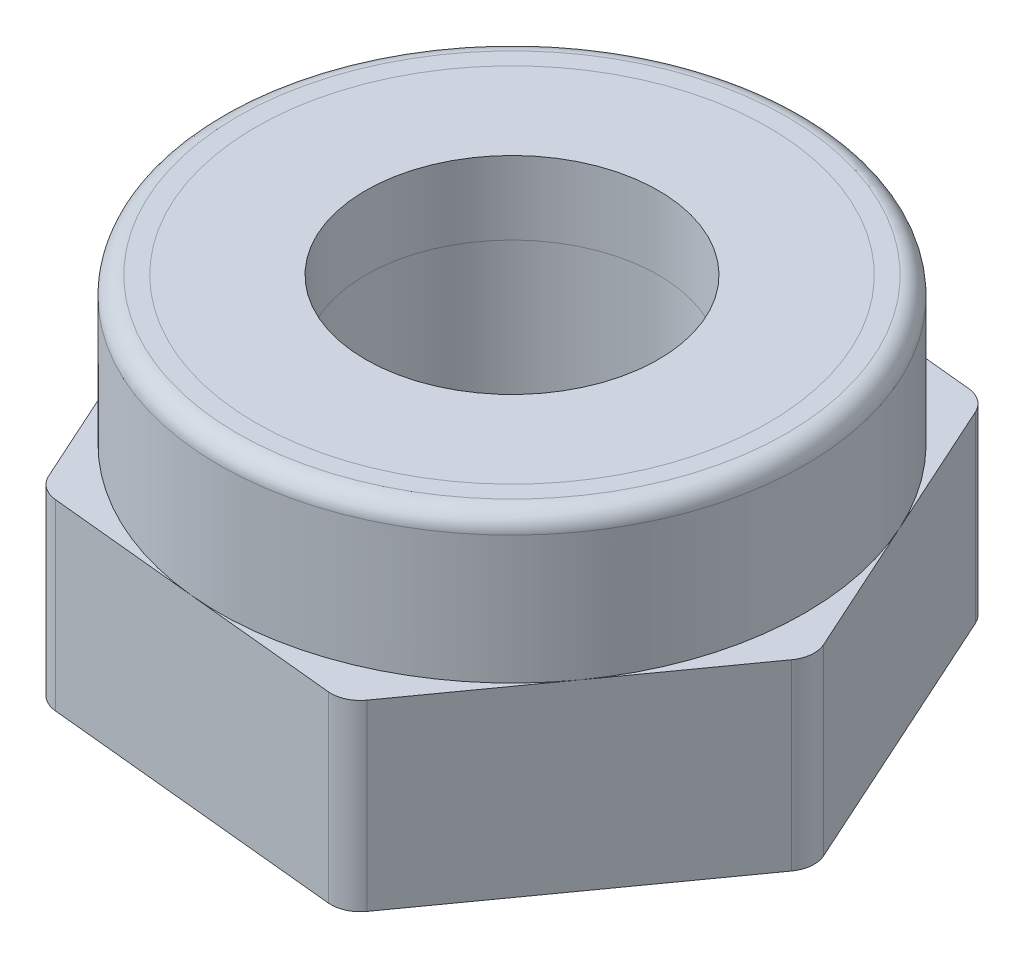
ISO-10303-21;
HEADER;
FILE_DESCRIPTION(('STEP AP214'),'2;1');
FILE_NAME('part.step','',(''),(''),'','','');
FILE_SCHEMA(('AUTOMOTIVE_DESIGN { 1 0 10303 214 1 1 1 1 }'));
ENDSEC;
DATA;
#1=APPLICATION_CONTEXT('core data for automotive mechanical design processes');
#2=APPLICATION_PROTOCOL_DEFINITION('international standard','automotive_design',2000,#1);
#3=PRODUCT_CONTEXT('',#1,'mechanical');
#4=PRODUCT('Part','Part','',(#3));
#5=PRODUCT_RELATED_PRODUCT_CATEGORY('part','',(#4));
#6=PRODUCT_DEFINITION_FORMATION('','',#4);
#7=PRODUCT_DEFINITION_CONTEXT('part definition',#1,'design');
#8=PRODUCT_DEFINITION('design','',#6,#7);
#9=PRODUCT_DEFINITION_SHAPE('','',#8);
#10=(LENGTH_UNIT() NAMED_UNIT(*) SI_UNIT(.MILLI.,.METRE.));
#11=(NAMED_UNIT(*) PLANE_ANGLE_UNIT() SI_UNIT($,.RADIAN.));
#12=(NAMED_UNIT(*) SI_UNIT($,.STERADIAN.) SOLID_ANGLE_UNIT());
#13=UNCERTAINTY_MEASURE_WITH_UNIT(LENGTH_MEASURE(1.E-05),#10,'distance_accuracy_value','');
#14=(GEOMETRIC_REPRESENTATION_CONTEXT(3) GLOBAL_UNCERTAINTY_ASSIGNED_CONTEXT((#13)) GLOBAL_UNIT_ASSIGNED_CONTEXT((#10,
#11,#12)) REPRESENTATION_CONTEXT('',''));
#15=CARTESIAN_POINT('',(0.,0.,0.));
#16=DIRECTION('',(0.,0.,1.));
#17=DIRECTION('',(1.,0.,0.));
#18=AXIS2_PLACEMENT_3D('',#15,#16,#17);
#19=CARTESIAN_POINT('',(0.,4.5,0.));
#20=DIRECTION('',(0.,-1.,0.));
#21=DIRECTION('',(0.,0.,-1.));
#22=AXIS2_PLACEMENT_3D('',#19,#20,#21);
#23=CYLINDRICAL_SURFACE('',#22,3.5);
#24=CARTESIAN_POINT('',(0.,4.5,0.));
#25=DIRECTION('',(0.,1.,0.));
#26=DIRECTION('',(0.,0.,1.));
#27=AXIS2_PLACEMENT_3D('',#24,#25,#26);
#28=CIRCLE('',#27,3.5);
#29=CARTESIAN_POINT('',(0.,4.5,3.5));
#30=VERTEX_POINT('',#29);
#31=EDGE_CURVE('E11',#30,#30,#28,.T.);
#32=ORIENTED_EDGE('',*,*,#31,.F.);
#33=EDGE_LOOP('',(#32));
#34=FACE_BOUND('',#33,.T.);
#35=CARTESIAN_POINT('',(0.,3.5,0.));
#36=DIRECTION('',(0.,1.,0.));
#37=DIRECTION('',(0.,0.,1.));
#38=AXIS2_PLACEMENT_3D('',#35,#36,#37);
#39=CIRCLE('',#38,3.5);
#40=CARTESIAN_POINT('',(0.,3.5,3.5));
#41=VERTEX_POINT('',#40);
#42=EDGE_CURVE('E50',#41,#41,#39,.T.);
#43=ORIENTED_EDGE('',*,*,#42,.T.);
#44=EDGE_LOOP('',(#43));
#45=FACE_BOUND('',#44,.T.);
#46=ADVANCED_FACE('F43',(#34,#45),#23,.T.);
#47=CARTESIAN_POINT('',(0.,4.5,0.));
#48=DIRECTION('',(0.,1.,0.));
#49=DIRECTION('',(0.,0.,1.));
#50=AXIS2_PLACEMENT_3D('',#47,#48,#49);
#51=PLANE('',#50);
#52=CARTESIAN_POINT('',(0.,4.5,0.));
#53=DIRECTION('',(0.,1.,0.));
#54=DIRECTION('',(0.,0.,1.));
#55=AXIS2_PLACEMENT_3D('',#52,#53,#54);
#56=CIRCLE('',#55,2.);
#57=CARTESIAN_POINT('',(0.,4.5,2.));
#58=VERTEX_POINT('',#57);
#59=EDGE_CURVE('E56',#58,#58,#56,.T.);
#60=ORIENTED_EDGE('',*,*,#59,.F.);
#61=EDGE_LOOP('',(#60));
#62=FACE_BOUND('',#61,.T.);
#63=ORIENTED_EDGE('',*,*,#31,.T.);
#64=EDGE_LOOP('',(#63));
#65=FACE_BOUND('',#64,.T.);
#66=ADVANCED_FACE('F72',(#62,#65),#51,.T.);
#67=CARTESIAN_POINT('',(0.,3.5,0.));
#68=DIRECTION('',(0.,1.,0.));
#69=DIRECTION('',(0.,0.,1.));
#70=AXIS2_PLACEMENT_3D('',#67,#68,#69);
#71=PLANE('',#70);
#72=CARTESIAN_POINT('',(0.,3.5,0.));
#73=DIRECTION('',(0.,1.,0.));
#74=DIRECTION('',(0.,0.,1.));
#75=AXIS2_PLACEMENT_3D('',#72,#73,#74);
#76=CIRCLE('',#75,2.);
#77=CARTESIAN_POINT('',(0.,3.5,2.));
#78=VERTEX_POINT('',#77);
#79=EDGE_CURVE('E46',#78,#78,#76,.T.);
#80=ORIENTED_EDGE('',*,*,#79,.T.);
#81=EDGE_LOOP('',(#80));
#82=FACE_BOUND('',#81,.T.);
#83=ORIENTED_EDGE('',*,*,#42,.F.);
#84=EDGE_LOOP('',(#83));
#85=FACE_BOUND('',#84,.T.);
#86=ADVANCED_FACE('F63',(#82,#85),#71,.F.);
#87=CARTESIAN_POINT('',(0.,0.,0.));
#88=DIRECTION('',(0.,1.,0.));
#89=DIRECTION('',(0.,0.,1.));
#90=AXIS2_PLACEMENT_3D('',#87,#88,#89);
#91=CYLINDRICAL_SURFACE('',#90,2.);
#92=ORIENTED_EDGE('',*,*,#59,.T.);
#93=EDGE_LOOP('',(#92));
#94=FACE_BOUND('',#93,.T.);
#95=ORIENTED_EDGE('',*,*,#79,.F.);
#96=EDGE_LOOP('',(#95));
#97=FACE_BOUND('',#96,.T.);
#98=ADVANCED_FACE('F66',(#94,#97),#91,.F.);
#99=CLOSED_SHELL('',(#46,#66,#86,#98));
#100=MANIFOLD_SOLID_BREP('B2',#99);
#101=CARTESIAN_POINT('',(0.,2.5,0.));
#102=DIRECTION('',(0.,1.,0.));
#103=DIRECTION('',(0.,0.,1.));
#104=AXIS2_PLACEMENT_3D('',#101,#102,#103);
#105=PLANE('',#104);
#106=CARTESIAN_POINT('',(0.,2.5,0.));
#107=DIRECTION('',(0.,1.,0.));
#108=DIRECTION('',(0.,0.,1.));
#109=AXIS2_PLACEMENT_3D('',#106,#107,#108);
#110=CIRCLE('',#109,4.);
#111=CARTESIAN_POINT('',(3.25051063843167,2.5,2.33113289827984));
#112=VERTEX_POINT('',#111);
#113=CARTESIAN_POINT('',(3.64407562872382,2.5,-1.64945833901348));
#114=VERTEX_POINT('',#113);
#115=EDGE_CURVE('E241',#112,#114,#110,.T.);
#116=ORIENTED_EDGE('',*,*,#115,.F.);
#117=DIRECTION('',(0.582783224569959,0.,-0.812627659607917));
#118=VECTOR('',#117,1.);
#119=CARTESIAN_POINT('',(1.90463043209301,2.5,4.2078160903821));
#120=LINE('',#119,#118);
#121=CARTESIAN_POINT('',(4.46180282413646,2.5,0.642118025387796));
#122=VERTEX_POINT('',#121);
#123=EDGE_CURVE('E228',#112,#122,#120,.T.);
#124=ORIENTED_EDGE('',*,*,#123,.T.);
#125=CARTESIAN_POINT('',(4.13675176029329,2.5,0.409004735559812));
#126=DIRECTION('',(0.,1.,0.));
#127=DIRECTION('',(0.,0.,1.));
#128=AXIS2_PLACEMENT_3D('',#125,#126,#127);
#129=CIRCLE('',#128,0.4);
#130=CARTESIAN_POINT('',(4.50115932316567,2.5,0.244058901658464));
#131=VERTEX_POINT('',#130);
#132=EDGE_CURVE('E318',#122,#131,#129,.T.);
#133=ORIENTED_EDGE('',*,*,#132,.T.);
#134=DIRECTION('',(-0.41236458475337,0.,-0.911018907180954));
#135=VECTOR('',#134,1.);
#136=CARTESIAN_POINT('',(4.59639084477032,2.5,0.454449706177569));
#137=LINE('',#136,#135);
#138=EDGE_CURVE('E243',#131,#114,#137,.T.);
#139=ORIENTED_EDGE('',*,*,#138,.T.);
#140=EDGE_LOOP('',(#116,#124,#133,#139));
#141=FACE_BOUND('',#140,.T.);
#142=ADVANCED_FACE('F107',(#141),#105,.T.);
#143=CARTESIAN_POINT('',(0.39356499029215,2.5,-3.98059123729332));
#144=VERTEX_POINT('',#143);
#145=EDGE_CURVE('E131',#114,#144,#110,.T.);
#146=ORIENTED_EDGE('',*,*,#145,.F.);
#147=CARTESIAN_POINT('',(2.78699193428196,2.5,-3.54297557968543));
#148=VERTEX_POINT('',#147);
#149=EDGE_CURVE('E227',#114,#148,#137,.T.);
#150=ORIENTED_EDGE('',*,*,#149,.T.);
#151=CARTESIAN_POINT('',(2.42258437140958,2.5,-3.37802974578408));
#152=DIRECTION('',(0.,1.,0.));
#153=DIRECTION('',(0.,0.,1.));
#154=AXIS2_PLACEMENT_3D('',#151,#152,#153);
#155=CIRCLE('',#154,0.4);
#156=CARTESIAN_POINT('',(2.4619408704388,2.5,-3.77608886951341));
#157=VERTEX_POINT('',#156);
#158=EDGE_CURVE('E320',#148,#157,#155,.T.);
#159=ORIENTED_EDGE('',*,*,#158,.T.);
#160=DIRECTION('',(-0.995147809323329,0.,-0.0983912475730374));
#161=VECTOR('',#160,1.);
#162=CARTESIAN_POINT('',(2.69176041267731,2.5,-3.75336638420453));
#163=LINE('',#162,#161);
#164=EDGE_CURVE('E266',#157,#144,#163,.T.);
#165=ORIENTED_EDGE('',*,*,#164,.T.);
#166=EDGE_LOOP('',(#146,#150,#159,#165));
#167=FACE_BOUND('',#166,.T.);
#168=ADVANCED_FACE('F395',(#167),#105,.T.);
#169=CARTESIAN_POINT('',(-3.25051063843167,2.5,-2.33113289827983));
#170=VERTEX_POINT('',#169);
#171=EDGE_CURVE('E123',#144,#170,#110,.T.);
#172=ORIENTED_EDGE('',*,*,#171,.F.);
#173=CARTESIAN_POINT('',(-1.67481088985449,2.5,-4.18509360507322));
#174=VERTEX_POINT('',#173);
#175=EDGE_CURVE('E265',#144,#174,#163,.T.);
#176=ORIENTED_EDGE('',*,*,#175,.T.);
#177=CARTESIAN_POINT('',(-1.71416738888371,2.5,-3.78703448134389));
#178=DIRECTION('',(0.,1.,0.));
#179=DIRECTION('',(0.,0.,1.));
#180=AXIS2_PLACEMENT_3D('',#177,#178,#179);
#181=CIRCLE('',#180,0.4);
#182=CARTESIAN_POINT('',(-2.03921845272688,2.5,-4.02014777117188));
#183=VERTEX_POINT('',#182);
#184=EDGE_CURVE('E322',#174,#183,#181,.T.);
#185=ORIENTED_EDGE('',*,*,#184,.T.);
#186=DIRECTION('',(-0.582783224569959,0.,0.812627659607917));
#187=VECTOR('',#186,1.);
#188=CARTESIAN_POINT('',(-1.90463043209301,2.5,-4.2078160903821));
#189=LINE('',#188,#187);
#190=EDGE_CURVE('E269',#183,#170,#189,.T.);
#191=ORIENTED_EDGE('',*,*,#190,.T.);
#192=EDGE_LOOP('',(#172,#176,#185,#191));
#193=FACE_BOUND('',#192,.T.);
#194=ADVANCED_FACE('F356',(#193),#105,.T.);
#195=CARTESIAN_POINT('',(-3.64407562872382,2.5,1.64945833901348));
#196=VERTEX_POINT('',#195);
#197=EDGE_CURVE('E253',#170,#196,#110,.T.);
#198=ORIENTED_EDGE('',*,*,#197,.F.);
#199=CARTESIAN_POINT('',(-4.46180282413646,2.5,-0.642118025387796));
#200=VERTEX_POINT('',#199);
#201=EDGE_CURVE('E268',#170,#200,#189,.T.);
#202=ORIENTED_EDGE('',*,*,#201,.T.);
#203=CARTESIAN_POINT('',(-4.13675176029329,2.5,-0.409004735559812));
#204=DIRECTION('',(0.,1.,0.));
#205=DIRECTION('',(0.,0.,1.));
#206=AXIS2_PLACEMENT_3D('',#203,#204,#205);
#207=CIRCLE('',#206,0.4);
#208=CARTESIAN_POINT('',(-4.50115932316567,2.5,-0.244058901658464));
#209=VERTEX_POINT('',#208);
#210=EDGE_CURVE('E324',#200,#209,#207,.T.);
#211=ORIENTED_EDGE('',*,*,#210,.T.);
#212=DIRECTION('',(0.41236458475337,0.,0.911018907180954));
#213=VECTOR('',#212,1.);
#214=CARTESIAN_POINT('',(-4.59639084477032,2.5,-0.454449706177569));
#215=LINE('',#214,#213);
#216=EDGE_CURVE('E272',#209,#196,#215,.T.);
#217=ORIENTED_EDGE('',*,*,#216,.T.);
#218=EDGE_LOOP('',(#198,#202,#211,#217));
#219=FACE_BOUND('',#218,.T.);
#220=ADVANCED_FACE('F348',(#219),#105,.T.);
#221=CARTESIAN_POINT('',(-0.39356499029215,2.5,3.98059123729332));
#222=VERTEX_POINT('',#221);
#223=EDGE_CURVE('E251',#196,#222,#110,.T.);
#224=ORIENTED_EDGE('',*,*,#223,.F.);
#225=CARTESIAN_POINT('',(-2.78699193428196,2.5,3.54297557968543));
#226=VERTEX_POINT('',#225);
#227=EDGE_CURVE('E271',#196,#226,#215,.T.);
#228=ORIENTED_EDGE('',*,*,#227,.T.);
#229=CARTESIAN_POINT('',(-2.42258437140958,2.5,3.37802974578408));
#230=DIRECTION('',(0.,1.,0.));
#231=DIRECTION('',(0.,0.,1.));
#232=AXIS2_PLACEMENT_3D('',#229,#230,#231);
#233=CIRCLE('',#232,0.4);
#234=CARTESIAN_POINT('',(-2.4619408704388,2.5,3.77608886951341));
#235=VERTEX_POINT('',#234);
#236=EDGE_CURVE('E315',#226,#235,#233,.T.);
#237=ORIENTED_EDGE('',*,*,#236,.T.);
#238=DIRECTION('',(0.995147809323329,0.,0.0983912475730375));
#239=VECTOR('',#238,1.);
#240=CARTESIAN_POINT('',(-2.69176041267731,2.5,3.75336638420453));
#241=LINE('',#240,#239);
#242=EDGE_CURVE('E238',#235,#222,#241,.T.);
#243=ORIENTED_EDGE('',*,*,#242,.T.);
#244=EDGE_LOOP('',(#224,#228,#237,#243));
#245=FACE_BOUND('',#244,.T.);
#246=ADVANCED_FACE('F375',(#245),#105,.T.);
#247=CARTESIAN_POINT('',(-2.69176041267731,2.5,3.75336638420453));
#248=DIRECTION('',(0.0983912475730375,0.,-0.995147809323329));
#249=DIRECTION('',(-0.995147809323329,0.,-0.0983912475730375));
#250=AXIS2_PLACEMENT_3D('',#247,#248,#249);
#251=PLANE('',#250);
#252=DIRECTION('',(0.995147809323329,0.,0.0983912475730375));
#253=VECTOR('',#252,1.);
#254=CARTESIAN_POINT('',(-2.69176041267731,0.,3.75336638420453));
#255=LINE('',#254,#253);
#256=CARTESIAN_POINT('',(-2.4619408704388,0.,3.77608886951341));
#257=VERTEX_POINT('',#256);
#258=CARTESIAN_POINT('',(1.6748108898545,0.,4.18509360507322));
#259=VERTEX_POINT('',#258);
#260=EDGE_CURVE('E245',#257,#259,#255,.T.);
#261=ORIENTED_EDGE('',*,*,#260,.T.);
#262=DIRECTION('',(0.,-1.,0.));
#263=VECTOR('',#262,1.);
#264=CARTESIAN_POINT('',(1.6748108898545,2.5,4.18509360507322));
#265=LINE('',#264,#263);
#266=CARTESIAN_POINT('',(1.6748108898545,2.5,4.18509360507322));
#267=VERTEX_POINT('',#266);
#268=EDGE_CURVE('E252',#259,#267,#265,.F.);
#269=ORIENTED_EDGE('',*,*,#268,.T.);
#270=EDGE_CURVE('E262',#222,#267,#241,.T.);
#271=ORIENTED_EDGE('',*,*,#270,.F.);
#272=ORIENTED_EDGE('',*,*,#242,.F.);
#273=DIRECTION('',(0.,-1.,0.));
#274=VECTOR('',#273,1.);
#275=CARTESIAN_POINT('',(-2.4619408704388,2.5,3.77608886951341));
#276=LINE('',#275,#274);
#277=EDGE_CURVE('E255',#235,#257,#276,.T.);
#278=ORIENTED_EDGE('',*,*,#277,.T.);
#279=EDGE_LOOP('',(#261,#269,#271,#272,#278));
#280=FACE_BOUND('',#279,.T.);
#281=ADVANCED_FACE('F379',(#280),#251,.F.);
#282=CARTESIAN_POINT('',(1.90463043209301,2.5,4.2078160903821));
#283=DIRECTION('',(-0.812627659607917,0.,-0.582783224569959));
#284=DIRECTION('',(-0.582783224569959,0.,0.812627659607917));
#285=AXIS2_PLACEMENT_3D('',#282,#283,#284);
#286=PLANE('',#285);
#287=DIRECTION('',(0.582783224569959,0.,-0.812627659607917));
#288=VECTOR('',#287,1.);
#289=CARTESIAN_POINT('',(1.90463043209301,0.,4.2078160903821));
#290=LINE('',#289,#288);
#291=CARTESIAN_POINT('',(2.03921845272688,0.,4.02014777117188));
#292=VERTEX_POINT('',#291);
#293=CARTESIAN_POINT('',(4.46180282413646,0.,0.642118025387796));
#294=VERTEX_POINT('',#293);
#295=EDGE_CURVE('E278',#292,#294,#290,.T.);
#296=ORIENTED_EDGE('',*,*,#295,.T.);
#297=DIRECTION('',(0.,-1.,0.));
#298=VECTOR('',#297,1.);
#299=CARTESIAN_POINT('',(4.46180282413646,2.5,0.642118025387796));
#300=LINE('',#299,#298);
#301=EDGE_CURVE('E235',#294,#122,#300,.F.);
#302=ORIENTED_EDGE('',*,*,#301,.T.);
#303=ORIENTED_EDGE('',*,*,#123,.F.);
#304=CARTESIAN_POINT('',(2.03921845272688,2.5,4.02014777117188));
#305=VERTEX_POINT('',#304);
#306=EDGE_CURVE('E216',#305,#112,#120,.T.);
#307=ORIENTED_EDGE('',*,*,#306,.F.);
#308=DIRECTION('',(0.,-1.,0.));
#309=VECTOR('',#308,1.);
#310=CARTESIAN_POINT('',(2.03921845272688,2.5,4.02014777117188));
#311=LINE('',#310,#309);
#312=EDGE_CURVE('E338',#305,#292,#311,.T.);
#313=ORIENTED_EDGE('',*,*,#312,.T.);
#314=EDGE_LOOP('',(#296,#302,#303,#307,#313));
#315=FACE_BOUND('',#314,.T.);
#316=ADVANCED_FACE('F233',(#315),#286,.F.);
#317=CARTESIAN_POINT('',(4.59639084477032,2.5,0.454449706177569));
#318=DIRECTION('',(-0.911018907180955,0.,0.41236458475337));
#319=DIRECTION('',(0.41236458475337,0.,0.911018907180955));
#320=AXIS2_PLACEMENT_3D('',#317,#318,#319);
#321=PLANE('',#320);
#322=DIRECTION('',(-0.41236458475337,0.,-0.911018907180954));
#323=VECTOR('',#322,1.);
#324=CARTESIAN_POINT('',(4.59639084477032,0.,0.454449706177569));
#325=LINE('',#324,#323);
#326=CARTESIAN_POINT('',(4.50115932316567,0.,0.244058901658464));
#327=VERTEX_POINT('',#326);
#328=CARTESIAN_POINT('',(2.78699193428196,0.,-3.54297557968543));
#329=VERTEX_POINT('',#328);
#330=EDGE_CURVE('E280',#327,#329,#325,.T.);
#331=ORIENTED_EDGE('',*,*,#330,.T.);
#332=DIRECTION('',(0.,-1.,0.));
#333=VECTOR('',#332,1.);
#334=CARTESIAN_POINT('',(2.78699193428196,2.5,-3.54297557968543));
#335=LINE('',#334,#333);
#336=EDGE_CURVE('E335',#329,#148,#335,.F.);
#337=ORIENTED_EDGE('',*,*,#336,.T.);
#338=ORIENTED_EDGE('',*,*,#149,.F.);
#339=ORIENTED_EDGE('',*,*,#138,.F.);
#340=DIRECTION('',(0.,-1.,0.));
#341=VECTOR('',#340,1.);
#342=CARTESIAN_POINT('',(4.50115932316567,2.5,0.244058901658464));
#343=LINE('',#342,#341);
#344=EDGE_CURVE('E332',#131,#327,#343,.T.);
#345=ORIENTED_EDGE('',*,*,#344,.T.);
#346=EDGE_LOOP('',(#331,#337,#338,#339,#345));
#347=FACE_BOUND('',#346,.T.);
#348=ADVANCED_FACE('F392',(#347),#321,.F.);
#349=CARTESIAN_POINT('',(2.69176041267731,2.5,-3.75336638420453));
#350=DIRECTION('',(-0.0983912475730374,0.,0.995147809323329));
#351=DIRECTION('',(0.995147809323329,0.,0.0983912475730374));
#352=AXIS2_PLACEMENT_3D('',#349,#350,#351);
#353=PLANE('',#352);
#354=DIRECTION('',(-0.995147809323329,0.,-0.0983912475730374));
#355=VECTOR('',#354,1.);
#356=CARTESIAN_POINT('',(2.69176041267731,0.,-3.75336638420453));
#357=LINE('',#356,#355);
#358=CARTESIAN_POINT('',(2.4619408704388,0.,-3.77608886951341));
#359=VERTEX_POINT('',#358);
#360=CARTESIAN_POINT('',(-1.67481088985449,0.,-4.18509360507322));
#361=VERTEX_POINT('',#360);
#362=EDGE_CURVE('E283',#359,#361,#357,.T.);
#363=ORIENTED_EDGE('',*,*,#362,.T.);
#364=DIRECTION('',(0.,-1.,0.));
#365=VECTOR('',#364,1.);
#366=CARTESIAN_POINT('',(-1.67481088985449,2.5,-4.18509360507322));
#367=LINE('',#366,#365);
#368=EDGE_CURVE('E329',#361,#174,#367,.F.);
#369=ORIENTED_EDGE('',*,*,#368,.T.);
#370=ORIENTED_EDGE('',*,*,#175,.F.);
#371=ORIENTED_EDGE('',*,*,#164,.F.);
#372=DIRECTION('',(0.,-1.,0.));
#373=VECTOR('',#372,1.);
#374=CARTESIAN_POINT('',(2.4619408704388,2.5,-3.77608886951341));
#375=LINE('',#374,#373);
#376=EDGE_CURVE('E326',#157,#359,#375,.T.);
#377=ORIENTED_EDGE('',*,*,#376,.T.);
#378=EDGE_LOOP('',(#363,#369,#370,#371,#377));
#379=FACE_BOUND('',#378,.T.);
#380=ADVANCED_FACE('F400',(#379),#353,.F.);
#381=CARTESIAN_POINT('',(-1.90463043209301,2.5,-4.2078160903821));
#382=DIRECTION('',(0.812627659607917,0.,0.582783224569959));
#383=DIRECTION('',(0.582783224569959,0.,-0.812627659607917));
#384=AXIS2_PLACEMENT_3D('',#381,#382,#383);
#385=PLANE('',#384);
#386=DIRECTION('',(-0.582783224569959,0.,0.812627659607917));
#387=VECTOR('',#386,1.);
#388=CARTESIAN_POINT('',(-1.90463043209301,0.,-4.2078160903821));
#389=LINE('',#388,#387);
#390=CARTESIAN_POINT('',(-2.03921845272688,0.,-4.02014777117188));
#391=VERTEX_POINT('',#390);
#392=CARTESIAN_POINT('',(-4.46180282413646,0.,-0.642118025387796));
#393=VERTEX_POINT('',#392);
#394=EDGE_CURVE('E286',#391,#393,#389,.T.);
#395=ORIENTED_EDGE('',*,*,#394,.T.);
#396=DIRECTION('',(0.,-1.,0.));
#397=VECTOR('',#396,1.);
#398=CARTESIAN_POINT('',(-4.46180282413646,2.5,-0.642118025387796));
#399=LINE('',#398,#397);
#400=EDGE_CURVE('E312',#393,#200,#399,.F.);
#401=ORIENTED_EDGE('',*,*,#400,.T.);
#402=ORIENTED_EDGE('',*,*,#201,.F.);
#403=ORIENTED_EDGE('',*,*,#190,.F.);
#404=DIRECTION('',(0.,-1.,0.));
#405=VECTOR('',#404,1.);
#406=CARTESIAN_POINT('',(-2.03921845272688,2.5,-4.02014777117188));
#407=LINE('',#406,#405);
#408=EDGE_CURVE('E309',#183,#391,#407,.T.);
#409=ORIENTED_EDGE('',*,*,#408,.T.);
#410=EDGE_LOOP('',(#395,#401,#402,#403,#409));
#411=FACE_BOUND('',#410,.T.);
#412=ADVANCED_FACE('F352',(#411),#385,.F.);
#413=CARTESIAN_POINT('',(-4.59639084477032,2.5,-0.454449706177569));
#414=DIRECTION('',(0.911018907180955,0.,-0.41236458475337));
#415=DIRECTION('',(-0.41236458475337,0.,-0.911018907180955));
#416=AXIS2_PLACEMENT_3D('',#413,#414,#415);
#417=PLANE('',#416);
#418=ORIENTED_EDGE('',*,*,#216,.F.);
#419=DIRECTION('',(0.,-1.,0.));
#420=VECTOR('',#419,1.);
#421=CARTESIAN_POINT('',(-4.50115932316567,2.5,-0.244058901658464));
#422=LINE('',#421,#420);
#423=CARTESIAN_POINT('',(-4.50115932316567,0.,-0.244058901658464));
#424=VERTEX_POINT('',#423);
#425=EDGE_CURVE('E294',#209,#424,#422,.T.);
#426=ORIENTED_EDGE('',*,*,#425,.T.);
#427=DIRECTION('',(0.41236458475337,0.,0.911018907180954));
#428=VECTOR('',#427,1.);
#429=CARTESIAN_POINT('',(-4.59639084477032,0.,-0.454449706177569));
#430=LINE('',#429,#428);
#431=CARTESIAN_POINT('',(-2.78699193428196,0.,3.54297557968543));
#432=VERTEX_POINT('',#431);
#433=EDGE_CURVE('E289',#424,#432,#430,.T.);
#434=ORIENTED_EDGE('',*,*,#433,.T.);
#435=DIRECTION('',(0.,-1.,0.));
#436=VECTOR('',#435,1.);
#437=CARTESIAN_POINT('',(-2.78699193428196,2.5,3.54297557968543));
#438=LINE('',#437,#436);
#439=EDGE_CURVE('E275',#432,#226,#438,.F.);
#440=ORIENTED_EDGE('',*,*,#439,.T.);
#441=ORIENTED_EDGE('',*,*,#227,.F.);
#442=EDGE_LOOP('',(#418,#426,#434,#440,#441));
#443=FACE_BOUND('',#442,.T.);
#444=ADVANCED_FACE('F370',(#443),#417,.F.);
#445=EDGE_CURVE('E220',#222,#112,#110,.T.);
#446=ORIENTED_EDGE('',*,*,#445,.F.);
#447=ORIENTED_EDGE('',*,*,#270,.T.);
#448=CARTESIAN_POINT('',(1.71416738888371,2.5,3.78703448134389));
#449=DIRECTION('',(0.,1.,0.));
#450=DIRECTION('',(0.,0.,1.));
#451=AXIS2_PLACEMENT_3D('',#448,#449,#450);
#452=CIRCLE('',#451,0.4);
#453=EDGE_CURVE('E223',#267,#305,#452,.T.);
#454=ORIENTED_EDGE('',*,*,#453,.T.);
#455=ORIENTED_EDGE('',*,*,#306,.T.);
#456=EDGE_LOOP('',(#446,#447,#454,#455));
#457=FACE_BOUND('',#456,.T.);
#458=ADVANCED_FACE('F218',(#457),#105,.T.);
#459=CARTESIAN_POINT('',(0.,0.,0.));
#460=DIRECTION('',(0.,1.,0.));
#461=DIRECTION('',(0.,0.,1.));
#462=AXIS2_PLACEMENT_3D('',#459,#460,#461);
#463=PLANE('',#462);
#464=CARTESIAN_POINT('',(0.,0.,0.));
#465=DIRECTION('',(0.,1.,0.));
#466=DIRECTION('',(0.,0.,1.));
#467=AXIS2_PLACEMENT_3D('',#464,#465,#466);
#468=CIRCLE('',#467,2.);
#469=CARTESIAN_POINT('',(0.,0.,2.));
#470=VERTEX_POINT('',#469);
#471=EDGE_CURVE('E614',#470,#470,#468,.T.);
#472=ORIENTED_EDGE('',*,*,#471,.T.);
#473=EDGE_LOOP('',(#472));
#474=FACE_BOUND('',#473,.T.);
#475=ORIENTED_EDGE('',*,*,#433,.F.);
#476=CARTESIAN_POINT('',(-4.13675176029329,0.,-0.409004735559812));
#477=DIRECTION('',(0.,1.,0.));
#478=DIRECTION('',(0.,0.,1.));
#479=AXIS2_PLACEMENT_3D('',#476,#477,#478);
#480=CIRCLE('',#479,0.4);
#481=EDGE_CURVE('E307',#424,#393,#480,.F.);
#482=ORIENTED_EDGE('',*,*,#481,.T.);
#483=ORIENTED_EDGE('',*,*,#394,.F.);
#484=CARTESIAN_POINT('',(-1.71416738888371,0.,-3.78703448134389));
#485=DIRECTION('',(0.,1.,0.));
#486=DIRECTION('',(0.,0.,1.));
#487=AXIS2_PLACEMENT_3D('',#484,#485,#486);
#488=CIRCLE('',#487,0.4);
#489=EDGE_CURVE('E305',#391,#361,#488,.F.);
#490=ORIENTED_EDGE('',*,*,#489,.T.);
#491=ORIENTED_EDGE('',*,*,#362,.F.);
#492=CARTESIAN_POINT('',(2.42258437140958,0.,-3.37802974578408));
#493=DIRECTION('',(0.,1.,0.));
#494=DIRECTION('',(0.,0.,1.));
#495=AXIS2_PLACEMENT_3D('',#492,#493,#494);
#496=CIRCLE('',#495,0.4);
#497=EDGE_CURVE('E303',#359,#329,#496,.F.);
#498=ORIENTED_EDGE('',*,*,#497,.T.);
#499=ORIENTED_EDGE('',*,*,#330,.F.);
#500=CARTESIAN_POINT('',(4.13675176029329,0.,0.409004735559812));
#501=DIRECTION('',(0.,1.,0.));
#502=DIRECTION('',(0.,0.,1.));
#503=AXIS2_PLACEMENT_3D('',#500,#501,#502);
#504=CIRCLE('',#503,0.4);
#505=EDGE_CURVE('E301',#327,#294,#504,.F.);
#506=ORIENTED_EDGE('',*,*,#505,.T.);
#507=ORIENTED_EDGE('',*,*,#295,.F.);
#508=CARTESIAN_POINT('',(1.71416738888371,0.,3.78703448134389));
#509=DIRECTION('',(0.,1.,0.));
#510=DIRECTION('',(0.,0.,1.));
#511=AXIS2_PLACEMENT_3D('',#508,#509,#510);
#512=CIRCLE('',#511,0.4);
#513=EDGE_CURVE('E299',#292,#259,#512,.F.);
#514=ORIENTED_EDGE('',*,*,#513,.T.);
#515=ORIENTED_EDGE('',*,*,#260,.F.);
#516=CARTESIAN_POINT('',(-2.42258437140958,0.,3.37802974578408));
#517=DIRECTION('',(0.,1.,0.));
#518=DIRECTION('',(0.,0.,1.));
#519=AXIS2_PLACEMENT_3D('',#516,#517,#518);
#520=CIRCLE('',#519,0.4);
#521=EDGE_CURVE('E297',#257,#432,#520,.F.);
#522=ORIENTED_EDGE('',*,*,#521,.T.);
#523=EDGE_LOOP('',(#475,#482,#483,#490,#491,#498,#499,#506,#507,#514,#515,#522));
#524=FACE_BOUND('',#523,.T.);
#525=ADVANCED_FACE('F364',(#474,#524),#463,.F.);
#526=CARTESIAN_POINT('',(-4.13675176029329,2.5,-0.409004735559812));
#527=DIRECTION('',(0.,-1.,0.));
#528=DIRECTION('',(0.,0.,-1.));
#529=AXIS2_PLACEMENT_3D('',#526,#527,#528);
#530=CYLINDRICAL_SURFACE('',#529,0.4);
#531=ORIENTED_EDGE('',*,*,#210,.F.);
#532=ORIENTED_EDGE('',*,*,#400,.F.);
#533=ORIENTED_EDGE('',*,*,#481,.F.);
#534=ORIENTED_EDGE('',*,*,#425,.F.);
#535=EDGE_LOOP('',(#531,#532,#533,#534));
#536=FACE_BOUND('',#535,.T.);
#537=ADVANCED_FACE('F368',(#536),#530,.T.);
#538=CARTESIAN_POINT('',(-1.71416738888371,2.5,-3.78703448134389));
#539=DIRECTION('',(0.,-1.,0.));
#540=DIRECTION('',(0.,0.,-1.));
#541=AXIS2_PLACEMENT_3D('',#538,#539,#540);
#542=CYLINDRICAL_SURFACE('',#541,0.4);
#543=ORIENTED_EDGE('',*,*,#184,.F.);
#544=ORIENTED_EDGE('',*,*,#368,.F.);
#545=ORIENTED_EDGE('',*,*,#489,.F.);
#546=ORIENTED_EDGE('',*,*,#408,.F.);
#547=EDGE_LOOP('',(#543,#544,#545,#546));
#548=FACE_BOUND('',#547,.T.);
#549=ADVANCED_FACE('F360',(#548),#542,.T.);
#550=CARTESIAN_POINT('',(2.42258437140958,2.5,-3.37802974578408));
#551=DIRECTION('',(0.,-1.,0.));
#552=DIRECTION('',(0.,0.,-1.));
#553=AXIS2_PLACEMENT_3D('',#550,#551,#552);
#554=CYLINDRICAL_SURFACE('',#553,0.4);
#555=ORIENTED_EDGE('',*,*,#158,.F.);
#556=ORIENTED_EDGE('',*,*,#336,.F.);
#557=ORIENTED_EDGE('',*,*,#497,.F.);
#558=ORIENTED_EDGE('',*,*,#376,.F.);
#559=EDGE_LOOP('',(#555,#556,#557,#558));
#560=FACE_BOUND('',#559,.T.);
#561=ADVANCED_FACE('F401',(#560),#554,.T.);
#562=CARTESIAN_POINT('',(4.13675176029329,2.5,0.409004735559812));
#563=DIRECTION('',(0.,-1.,0.));
#564=DIRECTION('',(0.,0.,-1.));
#565=AXIS2_PLACEMENT_3D('',#562,#563,#564);
#566=CYLINDRICAL_SURFACE('',#565,0.4);
#567=ORIENTED_EDGE('',*,*,#132,.F.);
#568=ORIENTED_EDGE('',*,*,#301,.F.);
#569=ORIENTED_EDGE('',*,*,#505,.F.);
#570=ORIENTED_EDGE('',*,*,#344,.F.);
#571=EDGE_LOOP('',(#567,#568,#569,#570));
#572=FACE_BOUND('',#571,.T.);
#573=ADVANCED_FACE('F390',(#572),#566,.T.);
#574=CARTESIAN_POINT('',(1.71416738888371,2.5,3.78703448134389));
#575=DIRECTION('',(0.,-1.,0.));
#576=DIRECTION('',(0.,0.,-1.));
#577=AXIS2_PLACEMENT_3D('',#574,#575,#576);
#578=CYLINDRICAL_SURFACE('',#577,0.4);
#579=ORIENTED_EDGE('',*,*,#453,.F.);
#580=ORIENTED_EDGE('',*,*,#268,.F.);
#581=ORIENTED_EDGE('',*,*,#513,.F.);
#582=ORIENTED_EDGE('',*,*,#312,.F.);
#583=EDGE_LOOP('',(#579,#580,#581,#582));
#584=FACE_BOUND('',#583,.T.);
#585=ADVANCED_FACE('F386',(#584),#578,.T.);
#586=CARTESIAN_POINT('',(-2.42258437140958,2.5,3.37802974578408));
#587=DIRECTION('',(0.,-1.,0.));
#588=DIRECTION('',(0.,0.,-1.));
#589=AXIS2_PLACEMENT_3D('',#586,#587,#588);
#590=CYLINDRICAL_SURFACE('',#589,0.4);
#591=ORIENTED_EDGE('',*,*,#236,.F.);
#592=ORIENTED_EDGE('',*,*,#439,.F.);
#593=ORIENTED_EDGE('',*,*,#521,.F.);
#594=ORIENTED_EDGE('',*,*,#277,.F.);
#595=EDGE_LOOP('',(#591,#592,#593,#594));
#596=FACE_BOUND('',#595,.T.);
#597=ADVANCED_FACE('F382',(#596),#590,.T.);
#598=CARTESIAN_POINT('',(0.,4.5,0.));
#599=DIRECTION('',(0.,-1.,0.));
#600=DIRECTION('',(0.,0.,-1.));
#601=AXIS2_PLACEMENT_3D('',#598,#599,#600);
#602=CYLINDRICAL_SURFACE('',#601,4.);
#603=CARTESIAN_POINT('',(0.,4.25,0.));
#604=DIRECTION('',(0.,1.,0.));
#605=DIRECTION('',(0.,0.,1.));
#606=AXIS2_PLACEMENT_3D('',#603,#604,#605);
#607=CIRCLE('',#606,4.);
#608=CARTESIAN_POINT('',(0.,4.25,4.));
#609=VERTEX_POINT('',#608);
#610=EDGE_CURVE('E41',#609,#609,#607,.F.);
#611=ORIENTED_EDGE('',*,*,#610,.T.);
#612=EDGE_LOOP('',(#611));
#613=FACE_BOUND('',#612,.T.);
#614=ORIENTED_EDGE('',*,*,#115,.T.);
#615=ORIENTED_EDGE('',*,*,#145,.T.);
#616=ORIENTED_EDGE('',*,*,#171,.T.);
#617=ORIENTED_EDGE('',*,*,#197,.T.);
#618=ORIENTED_EDGE('',*,*,#223,.T.);
#619=ORIENTED_EDGE('',*,*,#445,.T.);
#620=EDGE_LOOP('',(#614,#615,#616,#617,#618,#619));
#621=FACE_BOUND('',#620,.T.);
#622=ADVANCED_FACE('F249',(#613,#621),#602,.T.);
#623=CARTESIAN_POINT('',(0.,4.5,0.));
#624=DIRECTION('',(0.,1.,0.));
#625=DIRECTION('',(0.,0.,1.));
#626=AXIS2_PLACEMENT_3D('',#623,#624,#625);
#627=PLANE('',#626);
#628=CARTESIAN_POINT('',(0.,4.5,0.));
#629=DIRECTION('',(0.,1.,0.));
#630=DIRECTION('',(0.,0.,1.));
#631=AXIS2_PLACEMENT_3D('',#628,#629,#630);
#632=CIRCLE('',#631,3.5);
#633=CARTESIAN_POINT('',(0.,4.5,3.5));
#634=VERTEX_POINT('',#633);
#635=EDGE_CURVE('E259',#634,#634,#632,.T.);
#636=ORIENTED_EDGE('',*,*,#635,.F.);
#637=EDGE_LOOP('',(#636));
#638=FACE_BOUND('',#637,.T.);
#639=CARTESIAN_POINT('',(0.,4.5,0.));
#640=DIRECTION('',(0.,1.,0.));
#641=DIRECTION('',(0.,0.,1.));
#642=AXIS2_PLACEMENT_3D('',#639,#640,#641);
#643=CIRCLE('',#642,3.75);
#644=CARTESIAN_POINT('',(0.,4.5,3.75));
#645=VERTEX_POINT('',#644);
#646=EDGE_CURVE('E116',#645,#645,#643,.T.);
#647=ORIENTED_EDGE('',*,*,#646,.T.);
#648=EDGE_LOOP('',(#647));
#649=FACE_BOUND('',#648,.T.);
#650=ADVANCED_FACE('F527',(#638,#649),#627,.T.);
#651=CARTESIAN_POINT('',(0.,4.25,0.));
#652=DIRECTION('',(0.,1.,0.));
#653=DIRECTION('',(0.,0.,1.));
#654=AXIS2_PLACEMENT_3D('',#651,#652,#653);
#655=TOROIDAL_SURFACE('',#654,3.75,0.25);
#656=ORIENTED_EDGE('',*,*,#610,.F.);
#657=EDGE_LOOP('',(#656));
#658=FACE_BOUND('',#657,.T.);
#659=ORIENTED_EDGE('',*,*,#646,.F.);
#660=EDGE_LOOP('',(#659));
#661=FACE_BOUND('',#660,.T.);
#662=ADVANCED_FACE('F109',(#658,#661),#655,.T.);
#663=CARTESIAN_POINT('',(0.,3.5,0.));
#664=DIRECTION('',(0.,1.,0.));
#665=DIRECTION('',(0.,0.,1.));
#666=AXIS2_PLACEMENT_3D('',#663,#664,#665);
#667=CYLINDRICAL_SURFACE('',#666,3.5);
#668=CARTESIAN_POINT('',(0.,3.5,0.));
#669=DIRECTION('',(0.,1.,0.));
#670=DIRECTION('',(0.,0.,1.));
#671=AXIS2_PLACEMENT_3D('',#668,#669,#670);
#672=CIRCLE('',#671,3.5);
#673=CARTESIAN_POINT('',(0.,3.5,3.5));
#674=VERTEX_POINT('',#673);
#675=EDGE_CURVE('E246',#674,#674,#672,.T.);
#676=ORIENTED_EDGE('',*,*,#675,.F.);
#677=EDGE_LOOP('',(#676));
#678=FACE_BOUND('',#677,.T.);
#679=ORIENTED_EDGE('',*,*,#635,.T.);
#680=EDGE_LOOP('',(#679));
#681=FACE_BOUND('',#680,.T.);
#682=ADVANCED_FACE('F498',(#678,#681),#667,.F.);
#683=CARTESIAN_POINT('',(0.,3.5,0.));
#684=DIRECTION('',(0.,1.,0.));
#685=DIRECTION('',(0.,0.,1.));
#686=AXIS2_PLACEMENT_3D('',#683,#684,#685);
#687=PLANE('',#686);
#688=CARTESIAN_POINT('',(0.,3.5,0.));
#689=DIRECTION('',(0.,1.,0.));
#690=DIRECTION('',(0.,0.,1.));
#691=AXIS2_PLACEMENT_3D('',#688,#689,#690);
#692=CIRCLE('',#691,2.);
#693=CARTESIAN_POINT('',(0.,3.5,2.));
#694=VERTEX_POINT('',#693);
#695=EDGE_CURVE('E111',#694,#694,#692,.T.);
#696=ORIENTED_EDGE('',*,*,#695,.F.);
#697=EDGE_LOOP('',(#696));
#698=FACE_BOUND('',#697,.T.);
#699=ORIENTED_EDGE('',*,*,#675,.T.);
#700=EDGE_LOOP('',(#699));
#701=FACE_BOUND('',#700,.T.);
#702=ADVANCED_FACE('F503',(#698,#701),#687,.T.);
#703=CARTESIAN_POINT('',(0.,0.,0.));
#704=DIRECTION('',(0.,1.,0.));
#705=DIRECTION('',(0.,0.,1.));
#706=AXIS2_PLACEMENT_3D('',#703,#704,#705);
#707=CYLINDRICAL_SURFACE('',#706,2.);
#708=ORIENTED_EDGE('',*,*,#695,.T.);
#709=EDGE_LOOP('',(#708));
#710=FACE_BOUND('',#709,.T.);
#711=ORIENTED_EDGE('',*,*,#471,.F.);
#712=EDGE_LOOP('',(#711));
#713=FACE_BOUND('',#712,.T.);
#714=ADVANCED_FACE('F508',(#710,#713),#707,.F.);
#715=CLOSED_SHELL('',(#142,#168,#194,#220,#246,#281,#316,#348,#380,#412,#444,#458,#525,#537,
#549,#561,#573,#585,#597,#622,#650,#662,#682,#702,#714));
#716=MANIFOLD_SOLID_BREP('B6',#715);
#717=ADVANCED_BREP_SHAPE_REPRESENTATION('',(#18,#100,#716),#14);
#718=SHAPE_DEFINITION_REPRESENTATION(#9,#717);
ENDSEC;
END-ISO-10303-21;
